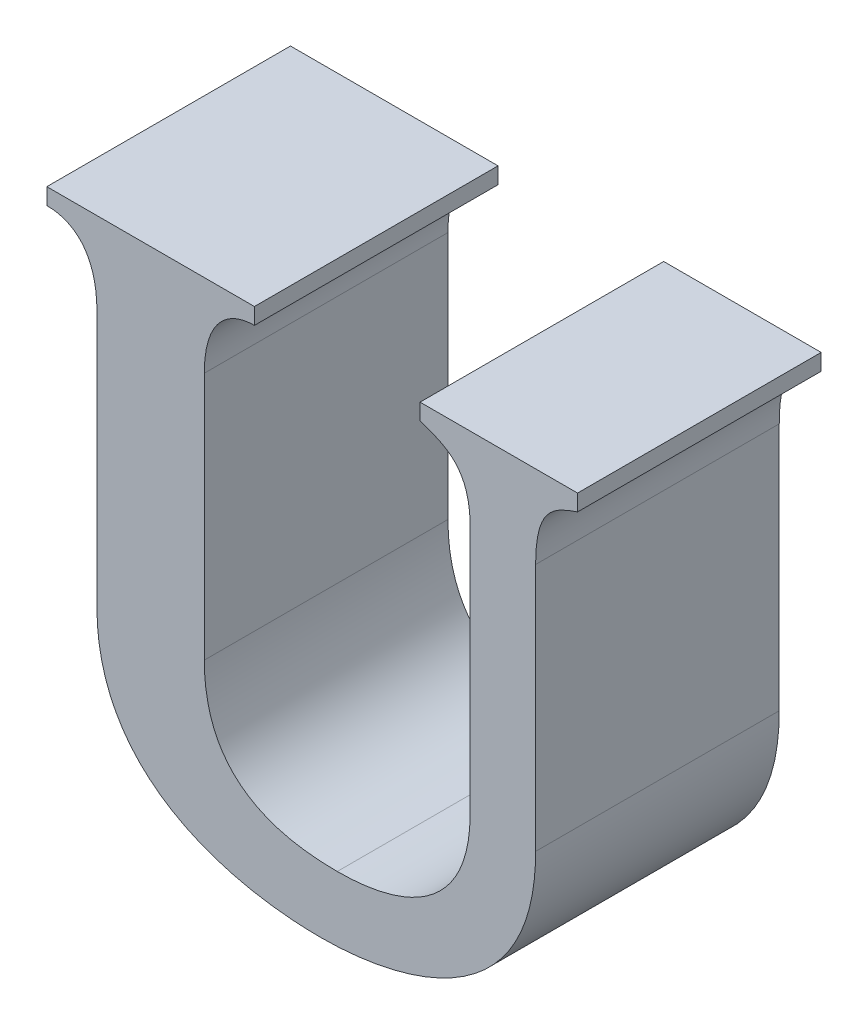
ISO-10303-21;
HEADER;
FILE_DESCRIPTION(('STEP AP214'),'2;1');
FILE_NAME('part.step','',(''),(''),'','','');
FILE_SCHEMA(('AUTOMOTIVE_DESIGN { 1 0 10303 214 1 1 1 1 }'));
ENDSEC;
DATA;
#1=APPLICATION_CONTEXT('core data for automotive mechanical design processes');
#2=APPLICATION_PROTOCOL_DEFINITION('international standard','automotive_design',2000,#1);
#3=PRODUCT_CONTEXT('',#1,'mechanical');
#4=PRODUCT('Part','Part','',(#3));
#5=PRODUCT_RELATED_PRODUCT_CATEGORY('part','',(#4));
#6=PRODUCT_DEFINITION_FORMATION('','',#4);
#7=PRODUCT_DEFINITION_CONTEXT('part definition',#1,'design');
#8=PRODUCT_DEFINITION('design','',#6,#7);
#9=PRODUCT_DEFINITION_SHAPE('','',#8);
#10=(LENGTH_UNIT() NAMED_UNIT(*) SI_UNIT(.MILLI.,.METRE.));
#11=(NAMED_UNIT(*) PLANE_ANGLE_UNIT() SI_UNIT($,.RADIAN.));
#12=(NAMED_UNIT(*) SI_UNIT($,.STERADIAN.) SOLID_ANGLE_UNIT());
#13=UNCERTAINTY_MEASURE_WITH_UNIT(LENGTH_MEASURE(1.E-05),#10,'distance_accuracy_value','');
#14=(GEOMETRIC_REPRESENTATION_CONTEXT(3) GLOBAL_UNCERTAINTY_ASSIGNED_CONTEXT((#13)) GLOBAL_UNIT_ASSIGNED_CONTEXT((#10,
#11,#12)) REPRESENTATION_CONTEXT('',''));
#15=CARTESIAN_POINT('',(0.,0.,0.));
#16=DIRECTION('',(0.,0.,1.));
#17=DIRECTION('',(1.,0.,0.));
#18=AXIS2_PLACEMENT_3D('',#15,#16,#17);
#19=CARTESIAN_POINT('',(1.821794704182,-0.25323453724898,0.));
#20=DIRECTION('',(0.,1.,0.));
#21=DIRECTION('',(-1.,0.,0.));
#22=AXIS2_PLACEMENT_3D('',#19,#20,#21);
#23=PLANE('',#22);
#24=DIRECTION('',(1.,0.,0.));
#25=VECTOR('',#24,1.);
#26=CARTESIAN_POINT('',(1.736592721171,-0.25323453724898,0.));
#27=LINE('',#26,#25);
#28=CARTESIAN_POINT('',(1.736592721171,-0.25323453724898,0.));
#29=VERTEX_POINT('',#28);
#30=CARTESIAN_POINT('',(1.821794704182,-0.25323453724898,0.));
#31=VERTEX_POINT('',#30);
#32=EDGE_CURVE('E11',#29,#31,#27,.T.);
#33=ORIENTED_EDGE('',*,*,#32,.F.);
#34=DIRECTION('',(0.,0.,1.));
#35=VECTOR('',#34,1.);
#36=CARTESIAN_POINT('',(1.736592721171,-0.25323453724898,0.));
#37=LINE('',#36,#35);
#38=CARTESIAN_POINT('',(1.736592721171,-0.25323453724898,0.1));
#39=VERTEX_POINT('',#38);
#40=EDGE_CURVE('E24',#29,#39,#37,.T.);
#41=ORIENTED_EDGE('',*,*,#40,.T.);
#42=DIRECTION('',(-1.,0.,0.));
#43=VECTOR('',#42,1.);
#44=CARTESIAN_POINT('',(1.736592721171,-0.25323453724898,0.1));
#45=LINE('',#44,#43);
#46=CARTESIAN_POINT('',(1.821794704182,-0.25323453724898,0.1));
#47=VERTEX_POINT('',#46);
#48=EDGE_CURVE('E160',#47,#39,#45,.T.);
#49=ORIENTED_EDGE('',*,*,#48,.F.);
#50=DIRECTION('',(0.,0.,1.));
#51=VECTOR('',#50,1.);
#52=CARTESIAN_POINT('',(1.821794704182,-0.25323453724898,0.));
#53=LINE('',#52,#51);
#54=EDGE_CURVE('E361',#31,#47,#53,.T.);
#55=ORIENTED_EDGE('',*,*,#54,.F.);
#56=EDGE_LOOP('',(#33,#41,#49,#55));
#57=FACE_BOUND('',#56,.T.);
#58=ADVANCED_FACE('F17',(#57),#23,.T.);
#59=CARTESIAN_POINT('',(1.821794704182,-0.25995003071244,0.));
#60=DIRECTION('',(1.,0.,0.));
#61=DIRECTION('',(0.,1.,0.));
#62=AXIS2_PLACEMENT_3D('',#59,#60,#61);
#63=PLANE('',#62);
#64=DIRECTION('',(0.,-1.,0.));
#65=VECTOR('',#64,1.);
#66=CARTESIAN_POINT('',(1.821794704182,-0.25323453724898,0.));
#67=LINE('',#66,#65);
#68=CARTESIAN_POINT('',(1.821794704182,-0.25995003071244,0.));
#69=VERTEX_POINT('',#68);
#70=EDGE_CURVE('E359',#31,#69,#67,.T.);
#71=ORIENTED_EDGE('',*,*,#70,.F.);
#72=ORIENTED_EDGE('',*,*,#54,.T.);
#73=DIRECTION('',(0.,1.,0.));
#74=VECTOR('',#73,1.);
#75=CARTESIAN_POINT('',(1.821794704182,-0.25323453724898,0.1));
#76=LINE('',#75,#74);
#77=CARTESIAN_POINT('',(1.821794704182,-0.25995003071244,0.1));
#78=VERTEX_POINT('',#77);
#79=EDGE_CURVE('E357',#78,#47,#76,.T.);
#80=ORIENTED_EDGE('',*,*,#79,.F.);
#81=DIRECTION('',(0.,0.,1.));
#82=VECTOR('',#81,1.);
#83=CARTESIAN_POINT('',(1.821794704182,-0.25995003071244,0.));
#84=LINE('',#83,#82);
#85=EDGE_CURVE('E351',#69,#78,#84,.T.);
#86=ORIENTED_EDGE('',*,*,#85,.F.);
#87=EDGE_LOOP('',(#71,#72,#80,#86));
#88=FACE_BOUND('',#87,.T.);
#89=ADVANCED_FACE('F423',(#88),#63,.T.);
#90=CARTESIAN_POINT('',(1.801228374823,-0.28723157278345,0.));
#91=CARTESIAN_POINT('',(1.801228374823,-0.28723157278345,0.1));
#92=CARTESIAN_POINT('',(1.801228374823,-0.26666549298124,0.));
#93=CARTESIAN_POINT('',(1.801228374823,-0.26666549298124,0.1));
#94=CARTESIAN_POINT('',(1.811722259451,-0.25995003071244,0.));
#95=CARTESIAN_POINT('',(1.811722259451,-0.25995003071244,0.1));
#96=CARTESIAN_POINT('',(1.821794704182,-0.25995003071244,0.));
#97=CARTESIAN_POINT('',(1.821794704182,-0.25995003071244,0.1));
#98=B_SPLINE_SURFACE_WITH_KNOTS('',3,1,((#90,#91),(#92,#93),(#94,#95),(#96,#97)),.UNSPECIFIED.,
.F.,.F.,.F.,(4,4),(2,2),(-1.,0.),(0.,0.01),.UNSPECIFIED.);
#99=CARTESIAN_POINT('',(1.821794704182,-0.25995003071244,0.));
#100=CARTESIAN_POINT('',(1.811722259451,-0.25995003071244,0.));
#101=CARTESIAN_POINT('',(1.801228374823,-0.26666549298124,0.));
#102=CARTESIAN_POINT('',(1.801228374823,-0.28723157278345,0.));
#103=B_SPLINE_CURVE_WITH_KNOTS('',3,(#99,#100,#101,#102),.UNSPECIFIED.,.F.,.F.,(4,4),(0.,1.),.UNSPECIFIED.);
#104=CARTESIAN_POINT('',(1.801228374823,-0.28723157278345,0.));
#105=VERTEX_POINT('',#104);
#106=EDGE_CURVE('E344',#69,#105,#103,.T.);
#107=CARTESIAN_POINT('',(1.801228374823,-0.28723157278345,0.1));
#108=CARTESIAN_POINT('',(1.801228374823,-0.26666549298124,0.1));
#109=CARTESIAN_POINT('',(1.811722259451,-0.25995003071244,0.1));
#110=CARTESIAN_POINT('',(1.821794704182,-0.25995003071244,0.1));
#111=B_SPLINE_CURVE_WITH_KNOTS('',3,(#107,#108,#109,#110),.UNSPECIFIED.,.F.,.F.,(4,4),(-1.,0.),.UNSPECIFIED.);
#112=CARTESIAN_POINT('',(1.801228374823,-0.28723157278345,0.1));
#113=VERTEX_POINT('',#112);
#114=EDGE_CURVE('E339',#113,#78,#111,.T.);
#115=DIRECTION('',(0.,0.,1.));
#116=VECTOR('',#115,1.);
#117=CARTESIAN_POINT('',(1.801228374823,-0.28723157278345,0.));
#118=LINE('',#117,#116);
#119=EDGE_CURVE('E336',#105,#113,#118,.T.);
#120=ORIENTED_EDGE('',*,*,#106,.F.);
#121=ORIENTED_EDGE('',*,*,#85,.T.);
#122=ORIENTED_EDGE('',*,*,#114,.F.);
#123=ORIENTED_EDGE('',*,*,#119,.F.);
#124=EDGE_LOOP('',(#120,#121,#122,#123));
#125=FACE_BOUND('',#124,.T.);
#126=ADVANCED_FACE('F419',(#125),#98,.T.);
#127=CARTESIAN_POINT('',(1.801228374823,-0.389222679387,0.));
#128=DIRECTION('',(1.,0.,0.));
#129=DIRECTION('',(0.,1.,0.));
#130=AXIS2_PLACEMENT_3D('',#127,#128,#129);
#131=PLANE('',#130);
#132=DIRECTION('',(0.,-1.,0.));
#133=VECTOR('',#132,1.);
#134=CARTESIAN_POINT('',(1.801228374823,-0.28723157278345,0.));
#135=LINE('',#134,#133);
#136=CARTESIAN_POINT('',(1.801228374823,-0.389222679387,0.));
#137=VERTEX_POINT('',#136);
#138=EDGE_CURVE('E334',#105,#137,#135,.T.);
#139=ORIENTED_EDGE('',*,*,#138,.F.);
#140=ORIENTED_EDGE('',*,*,#119,.T.);
#141=DIRECTION('',(0.,1.,0.));
#142=VECTOR('',#141,1.);
#143=CARTESIAN_POINT('',(1.801228374823,-0.28723157278345,0.1));
#144=LINE('',#143,#142);
#145=CARTESIAN_POINT('',(1.801228374823,-0.389222679387,0.1));
#146=VERTEX_POINT('',#145);
#147=EDGE_CURVE('E331',#146,#113,#144,.T.);
#148=ORIENTED_EDGE('',*,*,#147,.F.);
#149=DIRECTION('',(0.,0.,1.));
#150=VECTOR('',#149,1.);
#151=CARTESIAN_POINT('',(1.801228374823,-0.389222679387,0.));
#152=LINE('',#151,#150);
#153=EDGE_CURVE('E325',#137,#146,#152,.T.);
#154=ORIENTED_EDGE('',*,*,#153,.F.);
#155=EDGE_LOOP('',(#139,#140,#148,#154));
#156=FACE_BOUND('',#155,.T.);
#157=ADVANCED_FACE('F415',(#156),#131,.T.);
#158=CARTESIAN_POINT('',(1.855791583744,-0.437070394844,0.));
#159=CARTESIAN_POINT('',(1.855791583744,-0.437070394844,0.1));
#160=CARTESIAN_POINT('',(1.821794704182,-0.437070394844,0.));
#161=CARTESIAN_POINT('',(1.821794704182,-0.437070394844,0.1));
#162=CARTESIAN_POINT('',(1.801228374823,-0.423219683727,0.));
#163=CARTESIAN_POINT('',(1.801228374823,-0.423219683727,0.1));
#164=CARTESIAN_POINT('',(1.801228374823,-0.389222679387,0.));
#165=CARTESIAN_POINT('',(1.801228374823,-0.389222679387,0.1));
#166=B_SPLINE_SURFACE_WITH_KNOTS('',3,1,((#158,#159),(#160,#161),(#162,#163),(#164,#165)),
.UNSPECIFIED.,.F.,.F.,.F.,(4,4),(2,2),(-1.,0.),(0.,0.01),.UNSPECIFIED.);
#167=CARTESIAN_POINT('',(1.801228374823,-0.389222679387,0.));
#168=CARTESIAN_POINT('',(1.801228374823,-0.423219683727,0.));
#169=CARTESIAN_POINT('',(1.821794704182,-0.437070394844,0.));
#170=CARTESIAN_POINT('',(1.855791583744,-0.437070394844,0.));
#171=B_SPLINE_CURVE_WITH_KNOTS('',3,(#167,#168,#169,#170),.UNSPECIFIED.,.F.,.F.,(4,4),(0.,1.),.UNSPECIFIED.);
#172=CARTESIAN_POINT('',(1.855791583744,-0.437070394844,0.));
#173=VERTEX_POINT('',#172);
#174=EDGE_CURVE('E318',#137,#173,#171,.T.);
#175=CARTESIAN_POINT('',(1.855791583744,-0.437070394844,0.1));
#176=CARTESIAN_POINT('',(1.821794704182,-0.437070394844,0.1));
#177=CARTESIAN_POINT('',(1.801228374823,-0.423219683727,0.1));
#178=CARTESIAN_POINT('',(1.801228374823,-0.389222679387,0.1));
#179=B_SPLINE_CURVE_WITH_KNOTS('',3,(#175,#176,#177,#178),.UNSPECIFIED.,.F.,.F.,(4,4),(-1.,0.),.UNSPECIFIED.);
#180=CARTESIAN_POINT('',(1.855791583744,-0.437070394844,0.1));
#181=VERTEX_POINT('',#180);
#182=EDGE_CURVE('E313',#181,#146,#179,.T.);
#183=DIRECTION('',(0.,0.,1.));
#184=VECTOR('',#183,1.);
#185=CARTESIAN_POINT('',(1.855791583744,-0.437070394844,0.));
#186=LINE('',#185,#184);
#187=EDGE_CURVE('E307',#173,#181,#186,.T.);
#188=ORIENTED_EDGE('',*,*,#174,.F.);
#189=ORIENTED_EDGE('',*,*,#153,.T.);
#190=ORIENTED_EDGE('',*,*,#182,.F.);
#191=ORIENTED_EDGE('',*,*,#187,.F.);
#192=EDGE_LOOP('',(#188,#189,#190,#191));
#193=FACE_BOUND('',#192,.T.);
#194=ADVANCED_FACE('F411',(#193),#166,.T.);
#195=CARTESIAN_POINT('',(1.910354480718,-0.389222679387,0.));
#196=CARTESIAN_POINT('',(1.910354480718,-0.389222679387,0.1));
#197=CARTESIAN_POINT('',(1.910354480718,-0.393446854919855,0.));
#198=CARTESIAN_POINT('',(1.910354480718,-0.393446854919855,0.1));
#199=CARTESIAN_POINT('',(1.909985144712,-0.397689222280772,0.));
#200=CARTESIAN_POINT('',(1.909985144712,-0.397689222280772,0.1));
#201=CARTESIAN_POINT('',(1.908332803372,-0.405462305507936,0.));
#202=CARTESIAN_POINT('',(1.908332803372,-0.405462305507936,0.1));
#203=CARTESIAN_POINT('',(1.907167876861,-0.408995628782671,0.));
#204=CARTESIAN_POINT('',(1.907167876861,-0.408995628782671,0.1));
#205=CARTESIAN_POINT('',(1.903236646908,-0.417018830433757,0.));
#206=CARTESIAN_POINT('',(1.903236646908,-0.417018830433757,0.1));
#207=CARTESIAN_POINT('',(1.900126382609,-0.421099864381873,0.));
#208=CARTESIAN_POINT('',(1.900126382609,-0.421099864381873,0.1));
#209=CARTESIAN_POINT('',(1.892210737428,-0.42803023901775,0.));
#210=CARTESIAN_POINT('',(1.892210737428,-0.42803023901775,0.1));
#211=CARTESIAN_POINT('',(1.887594147933,-0.43066156763106,0.));
#212=CARTESIAN_POINT('',(1.887594147933,-0.43066156763106,0.1));
#213=CARTESIAN_POINT('',(1.874214763935,-0.435857018522879,0.));
#214=CARTESIAN_POINT('',(1.874214763935,-0.435857018522879,0.1));
#215=CARTESIAN_POINT('',(1.864860311646,-0.437070394844,0.));
#216=CARTESIAN_POINT('',(1.864860311646,-0.437070394844,0.1));
#217=CARTESIAN_POINT('',(1.855791583744,-0.437070394844,0.));
#218=CARTESIAN_POINT('',(1.855791583744,-0.437070394844,0.1));
#219=B_SPLINE_SURFACE_WITH_KNOTS('',3,1,((#195,#196),(#197,#198),(#199,#200),(#201,#202),(#203,
#204),(#205,#206),(#207,#208),(#209,#210),(#211,#212),(#213,#214),(#215,#216),(#217,#218)),
.UNSPECIFIED.,.F.,.F.,.F.,(4,2,2,2,2,4),(2,2),(-0.008279229743347,-0.007008356426133,
-0.005888063194087,-0.004319431026938,-0.002720618370698,0.),(0.,0.01),.UNSPECIFIED.);
#220=CARTESIAN_POINT('',(1.855791583744,-0.437070394844,0.));
#221=CARTESIAN_POINT('',(1.864860311646,-0.437070394844,0.));
#222=CARTESIAN_POINT('',(1.874214763935,-0.435857018522879,0.));
#223=CARTESIAN_POINT('',(1.887594147933,-0.43066156763106,0.));
#224=CARTESIAN_POINT('',(1.892210737428,-0.42803023901775,0.));
#225=CARTESIAN_POINT('',(1.900126382609,-0.421099864381873,0.));
#226=CARTESIAN_POINT('',(1.903236646908,-0.417018830433757,0.));
#227=CARTESIAN_POINT('',(1.907167876861,-0.408995628782671,0.));
#228=CARTESIAN_POINT('',(1.908332803372,-0.405462305507936,0.));
#229=CARTESIAN_POINT('',(1.909985144712,-0.397689222280772,0.));
#230=CARTESIAN_POINT('',(1.910354480718,-0.393446854919855,0.));
#231=CARTESIAN_POINT('',(1.910354480718,-0.389222679387,0.));
#232=B_SPLINE_CURVE_WITH_KNOTS('',3,(#220,#221,#222,#223,#224,#225,#226,#227,#228,#229,#230,
#231),.UNSPECIFIED.,.F.,.F.,(4,2,2,2,2,4),(0.,0.002720618370698,0.004319431026938,
0.005888063194087,0.007008356426133,0.008279229743347),.UNSPECIFIED.);
#233=CARTESIAN_POINT('',(1.910354480718,-0.389222679387,0.));
#234=VERTEX_POINT('',#233);
#235=EDGE_CURVE('E300',#173,#234,#232,.T.);
#236=CARTESIAN_POINT('',(1.910354480718,-0.389222679387,0.1));
#237=CARTESIAN_POINT('',(1.910354480718,-0.393446854919855,0.1));
#238=CARTESIAN_POINT('',(1.909985144712,-0.397689222280772,0.1));
#239=CARTESIAN_POINT('',(1.908332803372,-0.405462305507936,0.1));
#240=CARTESIAN_POINT('',(1.907167876861,-0.408995628782671,0.1));
#241=CARTESIAN_POINT('',(1.903236646908,-0.417018830433757,0.1));
#242=CARTESIAN_POINT('',(1.900126382609,-0.421099864381873,0.1));
#243=CARTESIAN_POINT('',(1.892210737428,-0.42803023901775,0.1));
#244=CARTESIAN_POINT('',(1.887594147933,-0.43066156763106,0.1));
#245=CARTESIAN_POINT('',(1.874214763935,-0.435857018522879,0.1));
#246=CARTESIAN_POINT('',(1.864860311646,-0.437070394844,0.1));
#247=CARTESIAN_POINT('',(1.855791583744,-0.437070394844,0.1));
#248=B_SPLINE_CURVE_WITH_KNOTS('',3,(#236,#237,#238,#239,#240,#241,#242,#243,#244,#245,#246,
#247),.UNSPECIFIED.,.F.,.F.,(4,2,2,2,2,4),(-0.008279229743347,-0.007008356426133,
-0.005888063194087,-0.004319431026938,-0.002720618370698,0.),.UNSPECIFIED.);
#249=CARTESIAN_POINT('',(1.910354480718,-0.389222679387,0.1));
#250=VERTEX_POINT('',#249);
#251=EDGE_CURVE('E295',#250,#181,#248,.T.);
#252=DIRECTION('',(0.,0.,1.));
#253=VECTOR('',#252,1.);
#254=CARTESIAN_POINT('',(1.910354480718,-0.389222679387,0.));
#255=LINE('',#254,#253);
#256=EDGE_CURVE('E292',#234,#250,#255,.T.);
#257=ORIENTED_EDGE('',*,*,#235,.F.);
#258=ORIENTED_EDGE('',*,*,#187,.T.);
#259=ORIENTED_EDGE('',*,*,#251,.F.);
#260=ORIENTED_EDGE('',*,*,#256,.F.);
#261=EDGE_LOOP('',(#257,#258,#259,#260));
#262=FACE_BOUND('',#261,.T.);
#263=ADVANCED_FACE('F407',(#262),#219,.T.);
#264=CARTESIAN_POINT('',(1.910354480718,-0.28723157278345,0.));
#265=DIRECTION('',(-1.,0.,0.));
#266=DIRECTION('',(0.,-1.,0.));
#267=AXIS2_PLACEMENT_3D('',#264,#265,#266);
#268=PLANE('',#267);
#269=DIRECTION('',(0.,1.,0.));
#270=VECTOR('',#269,1.);
#271=CARTESIAN_POINT('',(1.910354480718,-0.389222679387,0.));
#272=LINE('',#271,#270);
#273=CARTESIAN_POINT('',(1.910354480718,-0.28723157278345,0.));
#274=VERTEX_POINT('',#273);
#275=EDGE_CURVE('E290',#234,#274,#272,.T.);
#276=ORIENTED_EDGE('',*,*,#275,.F.);
#277=ORIENTED_EDGE('',*,*,#256,.T.);
#278=DIRECTION('',(0.,-1.,0.));
#279=VECTOR('',#278,1.);
#280=CARTESIAN_POINT('',(1.910354480718,-0.389222679387,0.1));
#281=LINE('',#280,#279);
#282=CARTESIAN_POINT('',(1.910354480718,-0.28723157278345,0.1));
#283=VERTEX_POINT('',#282);
#284=EDGE_CURVE('E287',#283,#250,#281,.T.);
#285=ORIENTED_EDGE('',*,*,#284,.F.);
#286=DIRECTION('',(0.,0.,1.));
#287=VECTOR('',#286,1.);
#288=CARTESIAN_POINT('',(1.910354480718,-0.28723157278345,0.));
#289=LINE('',#288,#287);
#290=EDGE_CURVE('E281',#274,#283,#289,.T.);
#291=ORIENTED_EDGE('',*,*,#290,.F.);
#292=EDGE_LOOP('',(#276,#277,#285,#291));
#293=FACE_BOUND('',#292,.T.);
#294=ADVANCED_FACE('F403',(#293),#268,.T.);
#295=CARTESIAN_POINT('',(1.889788463305,-0.25995003071244,0.));
#296=CARTESIAN_POINT('',(1.889788463305,-0.25995003071244,0.1));
#297=CARTESIAN_POINT('',(1.899862155822,-0.26330769945751,0.));
#298=CARTESIAN_POINT('',(1.899862155822,-0.26330769945751,0.1));
#299=CARTESIAN_POINT('',(1.910354480718,-0.26666549298124,0.));
#300=CARTESIAN_POINT('',(1.910354480718,-0.26666549298124,0.1));
#301=CARTESIAN_POINT('',(1.910354480718,-0.28723157278345,0.));
#302=CARTESIAN_POINT('',(1.910354480718,-0.28723157278345,0.1));
#303=B_SPLINE_SURFACE_WITH_KNOTS('',3,1,((#295,#296),(#297,#298),(#299,#300),(#301,#302)),
.UNSPECIFIED.,.F.,.F.,.F.,(4,4),(2,2),(-1.,0.),(0.,0.01),.UNSPECIFIED.);
#304=CARTESIAN_POINT('',(1.910354480718,-0.28723157278345,0.));
#305=CARTESIAN_POINT('',(1.910354480718,-0.26666549298124,0.));
#306=CARTESIAN_POINT('',(1.899862155822,-0.26330769945751,0.));
#307=CARTESIAN_POINT('',(1.889788463305,-0.25995003071244,0.));
#308=B_SPLINE_CURVE_WITH_KNOTS('',3,(#304,#305,#306,#307),.UNSPECIFIED.,.F.,.F.,(4,4),(0.,1.),.UNSPECIFIED.);
#309=CARTESIAN_POINT('',(1.889788463305,-0.25995003071244,0.));
#310=VERTEX_POINT('',#309);
#311=EDGE_CURVE('E274',#274,#310,#308,.T.);
#312=CARTESIAN_POINT('',(1.889788463305,-0.25995003071244,0.1));
#313=CARTESIAN_POINT('',(1.899862155822,-0.26330769945751,0.1));
#314=CARTESIAN_POINT('',(1.910354480718,-0.26666549298124,0.1));
#315=CARTESIAN_POINT('',(1.910354480718,-0.28723157278345,0.1));
#316=B_SPLINE_CURVE_WITH_KNOTS('',3,(#312,#313,#314,#315),.UNSPECIFIED.,.F.,.F.,(4,4),(-1.,0.),.UNSPECIFIED.);
#317=CARTESIAN_POINT('',(1.889788463305,-0.25995003071244,0.1));
#318=VERTEX_POINT('',#317);
#319=EDGE_CURVE('E269',#318,#283,#316,.T.);
#320=DIRECTION('',(0.,0.,1.));
#321=VECTOR('',#320,1.);
#322=CARTESIAN_POINT('',(1.889788463305,-0.25995003071244,0.));
#323=LINE('',#322,#321);
#324=EDGE_CURVE('E266',#310,#318,#323,.T.);
#325=ORIENTED_EDGE('',*,*,#311,.F.);
#326=ORIENTED_EDGE('',*,*,#290,.T.);
#327=ORIENTED_EDGE('',*,*,#319,.F.);
#328=ORIENTED_EDGE('',*,*,#324,.F.);
#329=EDGE_LOOP('',(#325,#326,#327,#328));
#330=FACE_BOUND('',#329,.T.);
#331=ADVANCED_FACE('F399',(#330),#303,.T.);
#332=CARTESIAN_POINT('',(1.889788463305,-0.25323453724898,0.));
#333=DIRECTION('',(-1.,0.,0.));
#334=DIRECTION('',(0.,-1.,0.));
#335=AXIS2_PLACEMENT_3D('',#332,#333,#334);
#336=PLANE('',#335);
#337=DIRECTION('',(0.,1.,0.));
#338=VECTOR('',#337,1.);
#339=CARTESIAN_POINT('',(1.889788463305,-0.25995003071244,0.));
#340=LINE('',#339,#338);
#341=CARTESIAN_POINT('',(1.889788463305,-0.25323453724898,0.));
#342=VERTEX_POINT('',#341);
#343=EDGE_CURVE('E264',#310,#342,#340,.T.);
#344=ORIENTED_EDGE('',*,*,#343,.F.);
#345=ORIENTED_EDGE('',*,*,#324,.T.);
#346=DIRECTION('',(0.,-1.,0.));
#347=VECTOR('',#346,1.);
#348=CARTESIAN_POINT('',(1.889788463305,-0.25995003071244,0.1));
#349=LINE('',#348,#347);
#350=CARTESIAN_POINT('',(1.889788463305,-0.25323453724898,0.1));
#351=VERTEX_POINT('',#350);
#352=EDGE_CURVE('E261',#351,#318,#349,.T.);
#353=ORIENTED_EDGE('',*,*,#352,.F.);
#354=DIRECTION('',(0.,0.,1.));
#355=VECTOR('',#354,1.);
#356=CARTESIAN_POINT('',(1.889788463305,-0.25323453724898,0.));
#357=LINE('',#356,#355);
#358=EDGE_CURVE('E258',#342,#351,#357,.T.);
#359=ORIENTED_EDGE('',*,*,#358,.F.);
#360=EDGE_LOOP('',(#344,#345,#353,#359));
#361=FACE_BOUND('',#360,.T.);
#362=ADVANCED_FACE('F395',(#361),#336,.T.);
#363=CARTESIAN_POINT('',(1.954425052797,-0.25323453724898,0.));
#364=DIRECTION('',(0.,1.,0.));
#365=DIRECTION('',(-1.,0.,0.));
#366=AXIS2_PLACEMENT_3D('',#363,#364,#365);
#367=PLANE('',#366);
#368=DIRECTION('',(1.,0.,0.));
#369=VECTOR('',#368,1.);
#370=CARTESIAN_POINT('',(1.889788463305,-0.25323453724898,0.));
#371=LINE('',#370,#369);
#372=CARTESIAN_POINT('',(1.954425052797,-0.25323453724898,0.));
#373=VERTEX_POINT('',#372);
#374=EDGE_CURVE('E256',#342,#373,#371,.T.);
#375=ORIENTED_EDGE('',*,*,#374,.F.);
#376=ORIENTED_EDGE('',*,*,#358,.T.);
#377=DIRECTION('',(-1.,0.,0.));
#378=VECTOR('',#377,1.);
#379=CARTESIAN_POINT('',(1.889788463305,-0.25323453724898,0.1));
#380=LINE('',#379,#378);
#381=CARTESIAN_POINT('',(1.954425052797,-0.25323453724898,0.1));
#382=VERTEX_POINT('',#381);
#383=EDGE_CURVE('E253',#382,#351,#380,.T.);
#384=ORIENTED_EDGE('',*,*,#383,.F.);
#385=DIRECTION('',(0.,0.,1.));
#386=VECTOR('',#385,1.);
#387=CARTESIAN_POINT('',(1.954425052797,-0.25323453724898,0.));
#388=LINE('',#387,#386);
#389=EDGE_CURVE('E250',#373,#382,#388,.T.);
#390=ORIENTED_EDGE('',*,*,#389,.F.);
#391=EDGE_LOOP('',(#375,#376,#384,#390));
#392=FACE_BOUND('',#391,.T.);
#393=ADVANCED_FACE('F391',(#392),#367,.T.);
#394=CARTESIAN_POINT('',(1.954425052797,-0.25995003071244,0.));
#395=DIRECTION('',(1.,0.,0.));
#396=DIRECTION('',(0.,1.,0.));
#397=AXIS2_PLACEMENT_3D('',#394,#395,#396);
#398=PLANE('',#397);
#399=DIRECTION('',(0.,-1.,0.));
#400=VECTOR('',#399,1.);
#401=CARTESIAN_POINT('',(1.954425052797,-0.25323453724898,0.));
#402=LINE('',#401,#400);
#403=CARTESIAN_POINT('',(1.954425052797,-0.25995003071244,0.));
#404=VERTEX_POINT('',#403);
#405=EDGE_CURVE('E248',#373,#404,#402,.T.);
#406=ORIENTED_EDGE('',*,*,#405,.F.);
#407=ORIENTED_EDGE('',*,*,#389,.T.);
#408=DIRECTION('',(0.,1.,0.));
#409=VECTOR('',#408,1.);
#410=CARTESIAN_POINT('',(1.954425052797,-0.25323453724898,0.1));
#411=LINE('',#410,#409);
#412=CARTESIAN_POINT('',(1.954425052797,-0.25995003071244,0.1));
#413=VERTEX_POINT('',#412);
#414=EDGE_CURVE('E245',#413,#382,#411,.T.);
#415=ORIENTED_EDGE('',*,*,#414,.F.);
#416=DIRECTION('',(0.,0.,1.));
#417=VECTOR('',#416,1.);
#418=CARTESIAN_POINT('',(1.954425052797,-0.25995003071244,0.));
#419=LINE('',#418,#417);
#420=EDGE_CURVE('E239',#404,#413,#419,.T.);
#421=ORIENTED_EDGE('',*,*,#420,.F.);
#422=EDGE_LOOP('',(#406,#407,#415,#421));
#423=FACE_BOUND('',#422,.T.);
#424=ADVANCED_FACE('F387',(#423),#398,.T.);
#425=CARTESIAN_POINT('',(1.937217140854,-0.28723157278345,0.));
#426=CARTESIAN_POINT('',(1.937217140854,-0.28723157278345,0.1));
#427=CARTESIAN_POINT('',(1.937217140854,-0.26666549298124,0.));
#428=CARTESIAN_POINT('',(1.937217140854,-0.26666549298124,0.1));
#429=CARTESIAN_POINT('',(1.944352608065,-0.26330769945751,0.));
#430=CARTESIAN_POINT('',(1.944352608065,-0.26330769945751,0.1));
#431=CARTESIAN_POINT('',(1.954425052797,-0.25995003071244,0.));
#432=CARTESIAN_POINT('',(1.954425052797,-0.25995003071244,0.1));
#433=B_SPLINE_SURFACE_WITH_KNOTS('',3,1,((#425,#426),(#427,#428),(#429,#430),(#431,#432)),
.UNSPECIFIED.,.F.,.F.,.F.,(4,4),(2,2),(-1.,0.),(0.,0.01),.UNSPECIFIED.);
#434=CARTESIAN_POINT('',(1.954425052797,-0.25995003071244,0.));
#435=CARTESIAN_POINT('',(1.944352608065,-0.26330769945751,0.));
#436=CARTESIAN_POINT('',(1.937217140854,-0.26666549298124,0.));
#437=CARTESIAN_POINT('',(1.937217140854,-0.28723157278345,0.));
#438=B_SPLINE_CURVE_WITH_KNOTS('',3,(#434,#435,#436,#437),.UNSPECIFIED.,.F.,.F.,(4,4),(0.,1.),.UNSPECIFIED.);
#439=CARTESIAN_POINT('',(1.937217140854,-0.28723157278345,0.));
#440=VERTEX_POINT('',#439);
#441=EDGE_CURVE('E232',#404,#440,#438,.T.);
#442=CARTESIAN_POINT('',(1.937217140854,-0.28723157278345,0.1));
#443=CARTESIAN_POINT('',(1.937217140854,-0.26666549298124,0.1));
#444=CARTESIAN_POINT('',(1.944352608065,-0.26330769945751,0.1));
#445=CARTESIAN_POINT('',(1.954425052797,-0.25995003071244,0.1));
#446=B_SPLINE_CURVE_WITH_KNOTS('',3,(#442,#443,#444,#445),.UNSPECIFIED.,.F.,.F.,(4,4),(-1.,0.),.UNSPECIFIED.);
#447=CARTESIAN_POINT('',(1.937217140854,-0.28723157278345,0.1));
#448=VERTEX_POINT('',#447);
#449=EDGE_CURVE('E227',#448,#413,#446,.T.);
#450=DIRECTION('',(0.,0.,1.));
#451=VECTOR('',#450,1.);
#452=CARTESIAN_POINT('',(1.937217140854,-0.28723157278345,0.));
#453=LINE('',#452,#451);
#454=EDGE_CURVE('E224',#440,#448,#453,.T.);
#455=ORIENTED_EDGE('',*,*,#441,.F.);
#456=ORIENTED_EDGE('',*,*,#420,.T.);
#457=ORIENTED_EDGE('',*,*,#449,.F.);
#458=ORIENTED_EDGE('',*,*,#454,.F.);
#459=EDGE_LOOP('',(#455,#456,#457,#458));
#460=FACE_BOUND('',#459,.T.);
#461=ADVANCED_FACE('F383',(#460),#433,.T.);
#462=CARTESIAN_POINT('',(1.937217140854,-0.389222679387,0.));
#463=DIRECTION('',(1.,0.,0.));
#464=DIRECTION('',(0.,1.,0.));
#465=AXIS2_PLACEMENT_3D('',#462,#463,#464);
#466=PLANE('',#465);
#467=DIRECTION('',(0.,-1.,0.));
#468=VECTOR('',#467,1.);
#469=CARTESIAN_POINT('',(1.937217140854,-0.28723157278345,0.));
#470=LINE('',#469,#468);
#471=CARTESIAN_POINT('',(1.937217140854,-0.389222679387,0.));
#472=VERTEX_POINT('',#471);
#473=EDGE_CURVE('E222',#440,#472,#470,.T.);
#474=ORIENTED_EDGE('',*,*,#473,.F.);
#475=ORIENTED_EDGE('',*,*,#454,.T.);
#476=DIRECTION('',(0.,1.,0.));
#477=VECTOR('',#476,1.);
#478=CARTESIAN_POINT('',(1.937217140854,-0.28723157278345,0.1));
#479=LINE('',#478,#477);
#480=CARTESIAN_POINT('',(1.937217140854,-0.389222679387,0.1));
#481=VERTEX_POINT('',#480);
#482=EDGE_CURVE('E219',#481,#448,#479,.T.);
#483=ORIENTED_EDGE('',*,*,#482,.F.);
#484=DIRECTION('',(0.,0.,1.));
#485=VECTOR('',#484,1.);
#486=CARTESIAN_POINT('',(1.937217140854,-0.389222679387,0.));
#487=LINE('',#486,#485);
#488=EDGE_CURVE('E213',#472,#481,#487,.T.);
#489=ORIENTED_EDGE('',*,*,#488,.F.);
#490=EDGE_LOOP('',(#474,#475,#483,#489));
#491=FACE_BOUND('',#490,.T.);
#492=ADVANCED_FACE('F379',(#491),#466,.T.);
#493=CARTESIAN_POINT('',(1.849075996696,-0.463932212725,0.));
#494=CARTESIAN_POINT('',(1.849075996696,-0.463932212725,0.1));
#495=CARTESIAN_POINT('',(1.883072876257,-0.463932212725,0.));
#496=CARTESIAN_POINT('',(1.883072876257,-0.463932212725,0.1));
#497=CARTESIAN_POINT('',(1.937217140854,-0.450501256992,0.));
#498=CARTESIAN_POINT('',(1.937217140854,-0.450501256992,0.1));
#499=CARTESIAN_POINT('',(1.937217140854,-0.389222679387,0.));
#500=CARTESIAN_POINT('',(1.937217140854,-0.389222679387,0.1));
#501=B_SPLINE_SURFACE_WITH_KNOTS('',3,1,((#493,#494),(#495,#496),(#497,#498),(#499,#500)),
.UNSPECIFIED.,.F.,.F.,.F.,(4,4),(2,2),(-1.,0.),(0.,0.01),.UNSPECIFIED.);
#502=CARTESIAN_POINT('',(1.937217140854,-0.389222679387,0.));
#503=CARTESIAN_POINT('',(1.937217140854,-0.450501256992,0.));
#504=CARTESIAN_POINT('',(1.883072876257,-0.463932212725,0.));
#505=CARTESIAN_POINT('',(1.849075996696,-0.463932212725,0.));
#506=B_SPLINE_CURVE_WITH_KNOTS('',3,(#502,#503,#504,#505),.UNSPECIFIED.,.F.,.F.,(4,4),(0.,1.),.UNSPECIFIED.);
#507=CARTESIAN_POINT('',(1.849075996696,-0.463932212725,0.));
#508=VERTEX_POINT('',#507);
#509=EDGE_CURVE('E206',#472,#508,#506,.T.);
#510=CARTESIAN_POINT('',(1.849075996696,-0.463932212725,0.1));
#511=CARTESIAN_POINT('',(1.883072876257,-0.463932212725,0.1));
#512=CARTESIAN_POINT('',(1.937217140854,-0.450501256992,0.1));
#513=CARTESIAN_POINT('',(1.937217140854,-0.389222679387,0.1));
#514=B_SPLINE_CURVE_WITH_KNOTS('',3,(#510,#511,#512,#513),.UNSPECIFIED.,.F.,.F.,(4,4),(-1.,0.),.UNSPECIFIED.);
#515=CARTESIAN_POINT('',(1.849075996696,-0.463932212725,0.1));
#516=VERTEX_POINT('',#515);
#517=EDGE_CURVE('E201',#516,#481,#514,.T.);
#518=DIRECTION('',(0.,0.,1.));
#519=VECTOR('',#518,1.);
#520=CARTESIAN_POINT('',(1.849075996696,-0.463932212725,0.));
#521=LINE('',#520,#519);
#522=EDGE_CURVE('E195',#508,#516,#521,.T.);
#523=ORIENTED_EDGE('',*,*,#509,.F.);
#524=ORIENTED_EDGE('',*,*,#488,.T.);
#525=ORIENTED_EDGE('',*,*,#517,.F.);
#526=ORIENTED_EDGE('',*,*,#522,.F.);
#527=EDGE_LOOP('',(#523,#524,#525,#526));
#528=FACE_BOUND('',#527,.T.);
#529=ADVANCED_FACE('F375',(#528),#501,.T.);
#530=CARTESIAN_POINT('',(1.75715905053,-0.392580472911,0.));
#531=CARTESIAN_POINT('',(1.75715905053,-0.392580472911,0.1));
#532=CARTESIAN_POINT('',(1.75715905053,-0.450501256992,0.));
#533=CARTESIAN_POINT('',(1.75715905053,-0.450501256992,0.1));
#534=CARTESIAN_POINT('',(1.811722259451,-0.463932212725,0.));
#535=CARTESIAN_POINT('',(1.811722259451,-0.463932212725,0.1));
#536=CARTESIAN_POINT('',(1.849075996696,-0.463932212725,0.));
#537=CARTESIAN_POINT('',(1.849075996696,-0.463932212725,0.1));
#538=B_SPLINE_SURFACE_WITH_KNOTS('',3,1,((#530,#531),(#532,#533),(#534,#535),(#536,#537)),
.UNSPECIFIED.,.F.,.F.,.F.,(4,4),(2,2),(-1.,0.),(0.,0.01),.UNSPECIFIED.);
#539=CARTESIAN_POINT('',(1.849075996696,-0.463932212725,0.));
#540=CARTESIAN_POINT('',(1.811722259451,-0.463932212725,0.));
#541=CARTESIAN_POINT('',(1.75715905053,-0.450501256992,0.));
#542=CARTESIAN_POINT('',(1.75715905053,-0.392580472911,0.));
#543=B_SPLINE_CURVE_WITH_KNOTS('',3,(#539,#540,#541,#542),.UNSPECIFIED.,.F.,.F.,(4,4),(0.,1.),.UNSPECIFIED.);
#544=CARTESIAN_POINT('',(1.75715905053,-0.392580472911,0.));
#545=VERTEX_POINT('',#544);
#546=EDGE_CURVE('E188',#508,#545,#543,.T.);
#547=CARTESIAN_POINT('',(1.75715905053,-0.392580472911,0.1));
#548=CARTESIAN_POINT('',(1.75715905053,-0.450501256992,0.1));
#549=CARTESIAN_POINT('',(1.811722259451,-0.463932212725,0.1));
#550=CARTESIAN_POINT('',(1.849075996696,-0.463932212725,0.1));
#551=B_SPLINE_CURVE_WITH_KNOTS('',3,(#547,#548,#549,#550),.UNSPECIFIED.,.F.,.F.,(4,4),(-1.,0.),.UNSPECIFIED.);
#552=CARTESIAN_POINT('',(1.75715905053,-0.392580472911,0.1));
#553=VERTEX_POINT('',#552);
#554=EDGE_CURVE('E183',#553,#516,#551,.T.);
#555=DIRECTION('',(0.,0.,1.));
#556=VECTOR('',#555,1.);
#557=CARTESIAN_POINT('',(1.75715905053,-0.392580472911,0.));
#558=LINE('',#557,#556);
#559=EDGE_CURVE('E180',#545,#553,#558,.T.);
#560=ORIENTED_EDGE('',*,*,#546,.F.);
#561=ORIENTED_EDGE('',*,*,#522,.T.);
#562=ORIENTED_EDGE('',*,*,#554,.F.);
#563=ORIENTED_EDGE('',*,*,#559,.F.);
#564=EDGE_LOOP('',(#560,#561,#562,#563));
#565=FACE_BOUND('',#564,.T.);
#566=ADVANCED_FACE('F371',(#565),#538,.T.);
#567=CARTESIAN_POINT('',(1.75715905053,-0.28723157278345,0.));
#568=DIRECTION('',(-1.,0.,0.));
#569=DIRECTION('',(0.,-1.,0.));
#570=AXIS2_PLACEMENT_3D('',#567,#568,#569);
#571=PLANE('',#570);
#572=DIRECTION('',(0.,1.,0.));
#573=VECTOR('',#572,1.);
#574=CARTESIAN_POINT('',(1.75715905053,-0.392580472911,0.));
#575=LINE('',#574,#573);
#576=CARTESIAN_POINT('',(1.75715905053,-0.28723157278345,0.));
#577=VERTEX_POINT('',#576);
#578=EDGE_CURVE('E178',#545,#577,#575,.T.);
#579=ORIENTED_EDGE('',*,*,#578,.F.);
#580=ORIENTED_EDGE('',*,*,#559,.T.);
#581=DIRECTION('',(0.,-1.,0.));
#582=VECTOR('',#581,1.);
#583=CARTESIAN_POINT('',(1.75715905053,-0.392580472911,0.1));
#584=LINE('',#583,#582);
#585=CARTESIAN_POINT('',(1.75715905053,-0.28723157278345,0.1));
#586=VERTEX_POINT('',#585);
#587=EDGE_CURVE('E176',#586,#553,#584,.T.);
#588=ORIENTED_EDGE('',*,*,#587,.F.);
#589=DIRECTION('',(0.,0.,1.));
#590=VECTOR('',#589,1.);
#591=CARTESIAN_POINT('',(1.75715905053,-0.28723157278345,0.));
#592=LINE('',#591,#590);
#593=EDGE_CURVE('E145',#577,#586,#592,.T.);
#594=ORIENTED_EDGE('',*,*,#593,.F.);
#595=EDGE_LOOP('',(#579,#580,#588,#594));
#596=FACE_BOUND('',#595,.T.);
#597=ADVANCED_FACE('F369',(#596),#571,.T.);
#598=CARTESIAN_POINT('',(1.736592721171,-0.25995003071244,0.));
#599=CARTESIAN_POINT('',(1.736592721171,-0.25995003071244,0.1));
#600=CARTESIAN_POINT('',(1.738340810979,-0.25995003071244,0.));
#601=CARTESIAN_POINT('',(1.738340810979,-0.25995003071244,0.1));
#602=CARTESIAN_POINT('',(1.74008863257,-0.260136425649247,0.));
#603=CARTESIAN_POINT('',(1.74008863257,-0.260136425649247,0.1));
#604=CARTESIAN_POINT('',(1.743491576526,-0.260963820354962,0.));
#605=CARTESIAN_POINT('',(1.743491576526,-0.260963820354962,0.1));
#606=CARTESIAN_POINT('',(1.745121198766,-0.261600377113948,0.));
#607=CARTESIAN_POINT('',(1.745121198766,-0.261600377113948,0.1));
#608=CARTESIAN_POINT('',(1.748682810017,-0.263669694366776,0.));
#609=CARTESIAN_POINT('',(1.748682810017,-0.263669694366776,0.1));
#610=CARTESIAN_POINT('',(1.750413530243,-0.265238084021717,0.));
#611=CARTESIAN_POINT('',(1.750413530243,-0.265238084021717,0.1));
#612=CARTESIAN_POINT('',(1.753527507109,-0.269359476532565,0.));
#613=CARTESIAN_POINT('',(1.753527507109,-0.269359476532565,0.1));
#614=CARTESIAN_POINT('',(1.754708066116,-0.271930156855463,0.));
#615=CARTESIAN_POINT('',(1.754708066116,-0.271930156855463,0.1));
#616=CARTESIAN_POINT('',(1.756737525093,-0.278636058680252,0.));
#617=CARTESIAN_POINT('',(1.756737525093,-0.278636058680252,0.1));
#618=CARTESIAN_POINT('',(1.75715905053,-0.283024606172614,0.));
#619=CARTESIAN_POINT('',(1.75715905053,-0.283024606172614,0.1));
#620=CARTESIAN_POINT('',(1.75715905053,-0.28723157278345,0.));
#621=CARTESIAN_POINT('',(1.75715905053,-0.28723157278345,0.1));
#622=B_SPLINE_SURFACE_WITH_KNOTS('',3,1,((#598,#599),(#600,#601),(#602,#603),(#604,#605),(#606,
#607),(#608,#609),(#610,#611),(#612,#613),(#614,#615),(#616,#617),(#618,#619),(#620,#621)),
.UNSPECIFIED.,.F.,.F.,.F.,(4,2,2,2,2,4),(2,2),(-0.003867404840271,-0.003341668891897,
-0.002814038632882,-0.002102866160555,-0.001262089983251,0.),(0.,0.01),.UNSPECIFIED.);
#623=CARTESIAN_POINT('',(1.75715905053,-0.28723157278345,0.));
#624=CARTESIAN_POINT('',(1.75715905053,-0.283024606172614,0.));
#625=CARTESIAN_POINT('',(1.756737525093,-0.278636058680252,0.));
#626=CARTESIAN_POINT('',(1.754708066116,-0.271930156855463,0.));
#627=CARTESIAN_POINT('',(1.753527507109,-0.269359476532565,0.));
#628=CARTESIAN_POINT('',(1.750413530243,-0.265238084021717,0.));
#629=CARTESIAN_POINT('',(1.748682810017,-0.263669694366776,0.));
#630=CARTESIAN_POINT('',(1.745121198766,-0.261600377113948,0.));
#631=CARTESIAN_POINT('',(1.743491576526,-0.260963820354962,0.));
#632=CARTESIAN_POINT('',(1.74008863257,-0.260136425649247,0.));
#633=CARTESIAN_POINT('',(1.738340810979,-0.25995003071244,0.));
#634=CARTESIAN_POINT('',(1.736592721171,-0.25995003071244,0.));
#635=B_SPLINE_CURVE_WITH_KNOTS('',3,(#623,#624,#625,#626,#627,#628,#629,#630,#631,#632,#633,
#634),.UNSPECIFIED.,.F.,.F.,(4,2,2,2,2,4),(0.,0.001262089983251,0.002102866160555,
0.002814038632882,0.003341668891897,0.003867404840271),.UNSPECIFIED.);
#636=CARTESIAN_POINT('',(1.736592721171,-0.25995003071244,0.));
#637=VERTEX_POINT('',#636);
#638=EDGE_CURVE('E149',#577,#637,#635,.T.);
#639=CARTESIAN_POINT('',(1.736592721171,-0.25995003071244,0.1));
#640=CARTESIAN_POINT('',(1.738340810979,-0.25995003071244,0.1));
#641=CARTESIAN_POINT('',(1.74008863257,-0.260136425649247,0.1));
#642=CARTESIAN_POINT('',(1.743491576526,-0.260963820354962,0.1));
#643=CARTESIAN_POINT('',(1.745121198766,-0.261600377113948,0.1));
#644=CARTESIAN_POINT('',(1.748682810017,-0.263669694366776,0.1));
#645=CARTESIAN_POINT('',(1.750413530243,-0.265238084021717,0.1));
#646=CARTESIAN_POINT('',(1.753527507109,-0.269359476532565,0.1));
#647=CARTESIAN_POINT('',(1.754708066116,-0.271930156855463,0.1));
#648=CARTESIAN_POINT('',(1.756737525093,-0.278636058680252,0.1));
#649=CARTESIAN_POINT('',(1.75715905053,-0.283024606172614,0.1));
#650=CARTESIAN_POINT('',(1.75715905053,-0.28723157278345,0.1));
#651=B_SPLINE_CURVE_WITH_KNOTS('',3,(#639,#640,#641,#642,#643,#644,#645,#646,#647,#648,#649,
#650),.UNSPECIFIED.,.F.,.F.,(4,2,2,2,2,4),(-0.003867404840271,-0.003341668891897,
-0.002814038632882,-0.002102866160555,-0.001262089983251,0.),.UNSPECIFIED.);
#652=CARTESIAN_POINT('',(1.736592721171,-0.25995003071244,0.1));
#653=VERTEX_POINT('',#652);
#654=EDGE_CURVE('E138',#653,#586,#651,.T.);
#655=DIRECTION('',(0.,0.,1.));
#656=VECTOR('',#655,1.);
#657=CARTESIAN_POINT('',(1.736592721171,-0.25995003071244,0.));
#658=LINE('',#657,#656);
#659=EDGE_CURVE('E142',#637,#653,#658,.T.);
#660=ORIENTED_EDGE('',*,*,#638,.F.);
#661=ORIENTED_EDGE('',*,*,#593,.T.);
#662=ORIENTED_EDGE('',*,*,#654,.F.);
#663=ORIENTED_EDGE('',*,*,#659,.F.);
#664=EDGE_LOOP('',(#660,#661,#662,#663));
#665=FACE_BOUND('',#664,.T.);
#666=ADVANCED_FACE('F141',(#665),#622,.T.);
#667=CARTESIAN_POINT('',(1.736592721171,-0.25323453724898,0.));
#668=DIRECTION('',(-1.,0.,0.));
#669=DIRECTION('',(0.,-1.,0.));
#670=AXIS2_PLACEMENT_3D('',#667,#668,#669);
#671=PLANE('',#670);
#672=DIRECTION('',(0.,1.,0.));
#673=VECTOR('',#672,1.);
#674=CARTESIAN_POINT('',(1.736592721171,-0.25995003071244,0.));
#675=LINE('',#674,#673);
#676=EDGE_CURVE('E155',#637,#29,#675,.T.);
#677=ORIENTED_EDGE('',*,*,#676,.F.);
#678=ORIENTED_EDGE('',*,*,#659,.T.);
#679=DIRECTION('',(0.,-1.,0.));
#680=VECTOR('',#679,1.);
#681=CARTESIAN_POINT('',(1.736592721171,-0.25995003071244,0.1));
#682=LINE('',#681,#680);
#683=EDGE_CURVE('E154',#39,#653,#682,.T.);
#684=ORIENTED_EDGE('',*,*,#683,.F.);
#685=ORIENTED_EDGE('',*,*,#40,.F.);
#686=EDGE_LOOP('',(#677,#678,#684,#685));
#687=FACE_BOUND('',#686,.T.);
#688=ADVANCED_FACE('F153',(#687),#671,.T.);
#689=CARTESIAN_POINT('',(1.849155214906,-0.34601953465329,0.));
#690=DIRECTION('',(0.,0.,1.));
#691=DIRECTION('',(1.,0.,0.));
#692=AXIS2_PLACEMENT_3D('',#689,#690,#691);
#693=PLANE('',#692);
#694=ORIENTED_EDGE('',*,*,#676,.T.);
#695=ORIENTED_EDGE('',*,*,#32,.T.);
#696=ORIENTED_EDGE('',*,*,#70,.T.);
#697=ORIENTED_EDGE('',*,*,#106,.T.);
#698=ORIENTED_EDGE('',*,*,#138,.T.);
#699=ORIENTED_EDGE('',*,*,#174,.T.);
#700=ORIENTED_EDGE('',*,*,#235,.T.);
#701=ORIENTED_EDGE('',*,*,#275,.T.);
#702=ORIENTED_EDGE('',*,*,#311,.T.);
#703=ORIENTED_EDGE('',*,*,#343,.T.);
#704=ORIENTED_EDGE('',*,*,#374,.T.);
#705=ORIENTED_EDGE('',*,*,#405,.T.);
#706=ORIENTED_EDGE('',*,*,#441,.T.);
#707=ORIENTED_EDGE('',*,*,#473,.T.);
#708=ORIENTED_EDGE('',*,*,#509,.T.);
#709=ORIENTED_EDGE('',*,*,#546,.T.);
#710=ORIENTED_EDGE('',*,*,#578,.T.);
#711=ORIENTED_EDGE('',*,*,#638,.T.);
#712=EDGE_LOOP('',(#694,#695,#696,#697,#698,#699,#700,#701,#702,#703,#704,#705,#706,#707,#708,
#709,#710,#711));
#713=FACE_BOUND('',#712,.T.);
#714=ADVANCED_FACE('F364',(#713),#693,.F.);
#715=CARTESIAN_POINT('',(1.849155214906,-0.34601953465329,0.1));
#716=DIRECTION('',(0.,0.,1.));
#717=DIRECTION('',(1.,0.,0.));
#718=AXIS2_PLACEMENT_3D('',#715,#716,#717);
#719=PLANE('',#718);
#720=ORIENTED_EDGE('',*,*,#683,.T.);
#721=ORIENTED_EDGE('',*,*,#654,.T.);
#722=ORIENTED_EDGE('',*,*,#587,.T.);
#723=ORIENTED_EDGE('',*,*,#554,.T.);
#724=ORIENTED_EDGE('',*,*,#517,.T.);
#725=ORIENTED_EDGE('',*,*,#482,.T.);
#726=ORIENTED_EDGE('',*,*,#449,.T.);
#727=ORIENTED_EDGE('',*,*,#414,.T.);
#728=ORIENTED_EDGE('',*,*,#383,.T.);
#729=ORIENTED_EDGE('',*,*,#352,.T.);
#730=ORIENTED_EDGE('',*,*,#319,.T.);
#731=ORIENTED_EDGE('',*,*,#284,.T.);
#732=ORIENTED_EDGE('',*,*,#251,.T.);
#733=ORIENTED_EDGE('',*,*,#182,.T.);
#734=ORIENTED_EDGE('',*,*,#147,.T.);
#735=ORIENTED_EDGE('',*,*,#114,.T.);
#736=ORIENTED_EDGE('',*,*,#79,.T.);
#737=ORIENTED_EDGE('',*,*,#48,.T.);
#738=EDGE_LOOP('',(#720,#721,#722,#723,#724,#725,#726,#727,#728,#729,#730,#731,#732,#733,#734,
#735,#736,#737));
#739=FACE_BOUND('',#738,.T.);
#740=ADVANCED_FACE('F158',(#739),#719,.T.);
#741=CLOSED_SHELL('',(#58,#89,#126,#157,#194,#263,#294,#331,#362,#393,#424,#461,#492,#529,#566,
#597,#666,#688,#714,#740));
#742=MANIFOLD_SOLID_BREP('B1',#741);
#743=ADVANCED_BREP_SHAPE_REPRESENTATION('',(#18,#742),#14);
#744=SHAPE_DEFINITION_REPRESENTATION(#9,#743);
ENDSEC;
END-ISO-10303-21;
